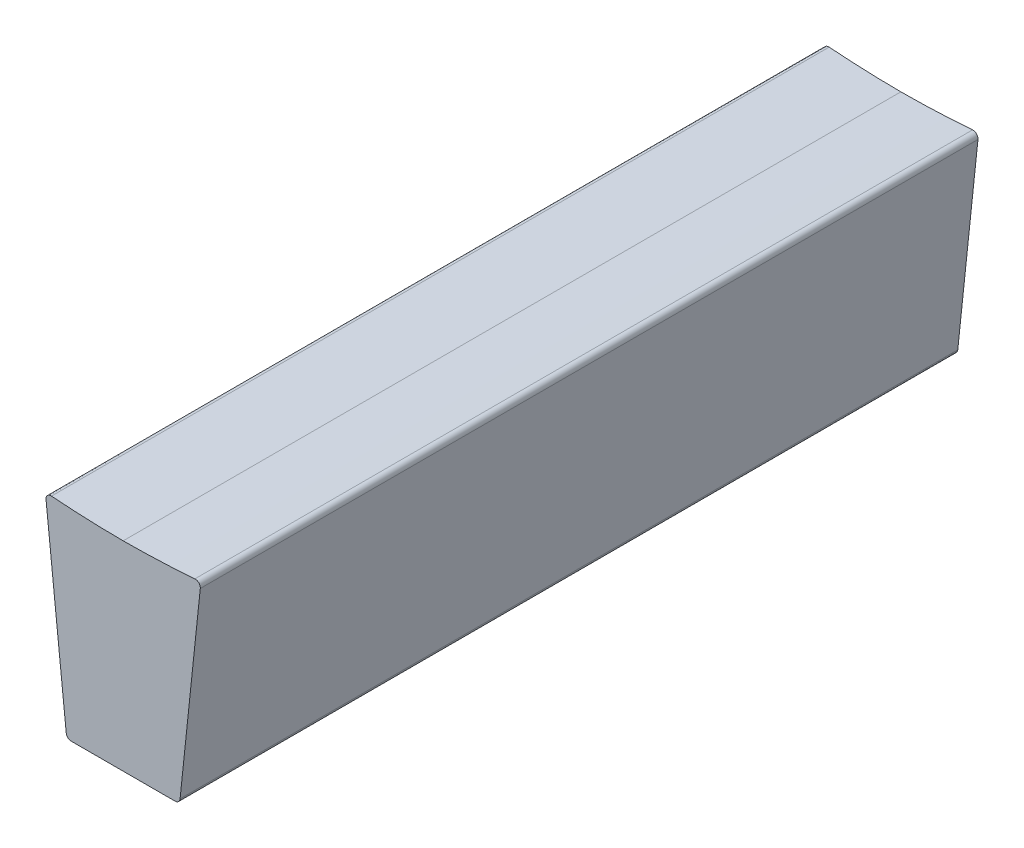
ISO-10303-21;
HEADER;
FILE_DESCRIPTION(('STEP AP214'),'2;1');
FILE_NAME('part.step','',(''),(''),'','','');
FILE_SCHEMA(('AUTOMOTIVE_DESIGN { 1 0 10303 214 1 1 1 1 }'));
ENDSEC;
DATA;
#1=APPLICATION_CONTEXT('core data for automotive mechanical design processes');
#2=APPLICATION_PROTOCOL_DEFINITION('international standard','automotive_design',2000,#1);
#3=PRODUCT_CONTEXT('',#1,'mechanical');
#4=PRODUCT('Part','Part','',(#3));
#5=PRODUCT_RELATED_PRODUCT_CATEGORY('part','',(#4));
#6=PRODUCT_DEFINITION_FORMATION('','',#4);
#7=PRODUCT_DEFINITION_CONTEXT('part definition',#1,'design');
#8=PRODUCT_DEFINITION('design','',#6,#7);
#9=PRODUCT_DEFINITION_SHAPE('','',#8);
#10=(LENGTH_UNIT() NAMED_UNIT(*) SI_UNIT(.MILLI.,.METRE.));
#11=(NAMED_UNIT(*) PLANE_ANGLE_UNIT() SI_UNIT($,.RADIAN.));
#12=(NAMED_UNIT(*) SI_UNIT($,.STERADIAN.) SOLID_ANGLE_UNIT());
#13=UNCERTAINTY_MEASURE_WITH_UNIT(LENGTH_MEASURE(1.E-05),#10,'distance_accuracy_value','');
#14=(GEOMETRIC_REPRESENTATION_CONTEXT(3) GLOBAL_UNCERTAINTY_ASSIGNED_CONTEXT((#13)) GLOBAL_UNIT_ASSIGNED_CONTEXT((#10,
#11,#12)) REPRESENTATION_CONTEXT('',''));
#15=CARTESIAN_POINT('',(0.,0.,0.));
#16=DIRECTION('',(0.,0.,1.));
#17=DIRECTION('',(1.,0.,0.));
#18=AXIS2_PLACEMENT_3D('',#15,#16,#17);
#19=CARTESIAN_POINT('',(-8.3468729420298,0.,-115.));
#20=DIRECTION('',(-0.994521895368274,-0.104528463267651,0.));
#21=DIRECTION('',(0.104528463267651,-0.994521895368274,0.));
#22=AXIS2_PLACEMENT_3D('',#19,#20,#21);
#23=PLANE('',#22);
#24=DIRECTION('',(0.104528463267651,-0.994521895368274,0.));
#25=VECTOR('',#24,1.);
#26=CARTESIAN_POINT('',(-8.3468729420298,0.,-115.));
#27=LINE('',#26,#25);
#28=CARTESIAN_POINT('',(-11.4056023895865,29.1018667309182,-115.));
#29=VERTEX_POINT('',#28);
#30=CARTESIAN_POINT('',(-8.41746133033262,0.671603652549262,-115.));
#31=VERTEX_POINT('',#30);
#32=EDGE_CURVE('E139',#29,#31,#27,.T.);
#33=ORIENTED_EDGE('',*,*,#32,.T.);
#34=DIRECTION('',(0.,0.,1.));
#35=VECTOR('',#34,1.);
#36=CARTESIAN_POINT('',(-8.41746133033262,0.671603652549262,-115.));
#37=LINE('',#36,#35);
#38=CARTESIAN_POINT('',(-8.41746133033262,0.671603652549262,0.));
#39=VERTEX_POINT('',#38);
#40=EDGE_CURVE('E167',#31,#39,#37,.T.);
#41=ORIENTED_EDGE('',*,*,#40,.T.);
#42=DIRECTION('',(0.104528463267651,-0.994521895368274,0.));
#43=VECTOR('',#42,1.);
#44=CARTESIAN_POINT('',(-8.3468729420298,0.,0.));
#45=LINE('',#44,#43);
#46=CARTESIAN_POINT('',(-11.4056023895865,29.1018667309182,0.));
#47=VERTEX_POINT('',#46);
#48=EDGE_CURVE('E128',#47,#39,#45,.T.);
#49=ORIENTED_EDGE('',*,*,#48,.F.);
#50=DIRECTION('',(0.,0.,1.));
#51=VECTOR('',#50,1.);
#52=CARTESIAN_POINT('',(-11.4056023895865,29.1018667309182,-115.));
#53=LINE('',#52,#51);
#54=EDGE_CURVE('E165',#47,#29,#53,.F.);
#55=ORIENTED_EDGE('',*,*,#54,.T.);
#56=EDGE_LOOP('',(#33,#41,#49,#55));
#57=FACE_BOUND('',#56,.T.);
#58=ADVANCED_FACE('F36',(#57),#23,.T.);
#59=CARTESIAN_POINT('',(0.557939675800536,174.832612543413,-115.));
#60=DIRECTION('',(0.,0.,1.));
#61=DIRECTION('',(1.,0.,0.));
#62=AXIS2_PLACEMENT_3D('',#59,#60,#61);
#63=CYLINDRICAL_SURFACE('',#62,145.333683519602);
#64=CARTESIAN_POINT('',(0.557939675800536,174.832612543413,-115.));
#65=DIRECTION('',(0.,0.,-1.));
#66=DIRECTION('',(1.,0.,0.));
#67=AXIS2_PLACEMENT_3D('',#64,#65,#66);
#68=CIRCLE('',#67,145.333683519602);
#69=CARTESIAN_POINT('',(0.,29.5,-115.));
#70=VERTEX_POINT('',#69);
#71=CARTESIAN_POINT('',(-10.6021190605988,29.9280485905279,-115.));
#72=VERTEX_POINT('',#71);
#73=EDGE_CURVE('E113',#70,#72,#68,.T.);
#74=ORIENTED_EDGE('',*,*,#73,.T.);
#75=DIRECTION('',(0.,0.,1.));
#76=VECTOR('',#75,1.);
#77=CARTESIAN_POINT('',(-10.6021190605988,29.9280485905279,-115.));
#78=LINE('',#77,#76);
#79=CARTESIAN_POINT('',(-10.6021190605988,29.9280485905279,0.));
#80=VERTEX_POINT('',#79);
#81=EDGE_CURVE('E11',#72,#80,#78,.T.);
#82=ORIENTED_EDGE('',*,*,#81,.T.);
#83=CARTESIAN_POINT('',(0.557939675800536,174.832612543413,0.));
#84=DIRECTION('',(0.,0.,-1.));
#85=DIRECTION('',(1.,0.,0.));
#86=AXIS2_PLACEMENT_3D('',#83,#84,#85);
#87=CIRCLE('',#86,145.333683519602);
#88=CARTESIAN_POINT('',(0.,29.5,0.));
#89=VERTEX_POINT('',#88);
#90=EDGE_CURVE('E120',#89,#80,#87,.T.);
#91=ORIENTED_EDGE('',*,*,#90,.F.);
#92=DIRECTION('',(0.,0.,1.));
#93=VECTOR('',#92,1.);
#94=CARTESIAN_POINT('',(0.,29.5,-115.));
#95=LINE('',#94,#93);
#96=EDGE_CURVE('E110',#70,#89,#95,.T.);
#97=ORIENTED_EDGE('',*,*,#96,.F.);
#98=EDGE_LOOP('',(#74,#82,#91,#97));
#99=FACE_BOUND('',#98,.T.);
#100=ADVANCED_FACE('F117',(#99),#63,.F.);
#101=CARTESIAN_POINT('',(-0.557939675800536,174.832612543413,-115.));
#102=DIRECTION('',(0.,0.,1.));
#103=DIRECTION('',(1.,0.,0.));
#104=AXIS2_PLACEMENT_3D('',#101,#102,#103);
#105=CYLINDRICAL_SURFACE('',#104,145.333683519602);
#106=CARTESIAN_POINT('',(-0.557939675800536,174.832612543413,0.));
#107=DIRECTION('',(0.,0.,-1.));
#108=DIRECTION('',(-1.,0.,0.));
#109=AXIS2_PLACEMENT_3D('',#106,#107,#108);
#110=CIRCLE('',#109,145.333683519602);
#111=CARTESIAN_POINT('',(10.6021190605988,29.9280485905279,0.));
#112=VERTEX_POINT('',#111);
#113=EDGE_CURVE('E137',#112,#89,#110,.T.);
#114=ORIENTED_EDGE('',*,*,#113,.F.);
#115=DIRECTION('',(0.,0.,1.));
#116=VECTOR('',#115,1.);
#117=CARTESIAN_POINT('',(10.6021190605988,29.9280485905279,-115.));
#118=LINE('',#117,#116);
#119=CARTESIAN_POINT('',(10.6021190605988,29.9280485905279,-115.));
#120=VERTEX_POINT('',#119);
#121=EDGE_CURVE('E44',#112,#120,#118,.F.);
#122=ORIENTED_EDGE('',*,*,#121,.T.);
#123=CARTESIAN_POINT('',(-0.557939675800536,174.832612543413,-115.));
#124=DIRECTION('',(0.,0.,-1.));
#125=DIRECTION('',(-1.,0.,0.));
#126=AXIS2_PLACEMENT_3D('',#123,#124,#125);
#127=CIRCLE('',#126,145.333683519602);
#128=EDGE_CURVE('E107',#120,#70,#127,.T.);
#129=ORIENTED_EDGE('',*,*,#128,.T.);
#130=ORIENTED_EDGE('',*,*,#96,.T.);
#131=EDGE_LOOP('',(#114,#122,#129,#130));
#132=FACE_BOUND('',#131,.T.);
#133=ADVANCED_FACE('F109',(#132),#105,.F.);
#134=CARTESIAN_POINT('',(8.3468729420298,0.,-115.));
#135=DIRECTION('',(0.994521895368274,-0.104528463267651,0.));
#136=DIRECTION('',(0.104528463267651,0.994521895368274,0.));
#137=AXIS2_PLACEMENT_3D('',#134,#135,#136);
#138=PLANE('',#137);
#139=DIRECTION('',(0.104528463267651,0.994521895368274,0.));
#140=VECTOR('',#139,1.);
#141=CARTESIAN_POINT('',(8.3468729420298,0.,0.));
#142=LINE('',#141,#140);
#143=CARTESIAN_POINT('',(8.41746133033262,0.671603652549262,0.));
#144=VERTEX_POINT('',#143);
#145=CARTESIAN_POINT('',(11.4056023895865,29.1018667309182,0.));
#146=VERTEX_POINT('',#145);
#147=EDGE_CURVE('E134',#144,#146,#142,.T.);
#148=ORIENTED_EDGE('',*,*,#147,.F.);
#149=DIRECTION('',(0.,0.,1.));
#150=VECTOR('',#149,1.);
#151=CARTESIAN_POINT('',(8.41746133033262,0.671603652549262,-115.));
#152=LINE('',#151,#150);
#153=CARTESIAN_POINT('',(8.41746133033262,0.671603652549262,-115.));
#154=VERTEX_POINT('',#153);
#155=EDGE_CURVE('E156',#144,#154,#152,.F.);
#156=ORIENTED_EDGE('',*,*,#155,.T.);
#157=DIRECTION('',(0.104528463267651,0.994521895368274,0.));
#158=VECTOR('',#157,1.);
#159=CARTESIAN_POINT('',(8.3468729420298,0.,-115.));
#160=LINE('',#159,#158);
#161=CARTESIAN_POINT('',(11.4056023895865,29.1018667309182,-115.));
#162=VERTEX_POINT('',#161);
#163=EDGE_CURVE('E114',#154,#162,#160,.T.);
#164=ORIENTED_EDGE('',*,*,#163,.T.);
#165=DIRECTION('',(0.,0.,1.));
#166=VECTOR('',#165,1.);
#167=CARTESIAN_POINT('',(11.4056023895865,29.1018667309182,-115.));
#168=LINE('',#167,#166);
#169=EDGE_CURVE('E153',#162,#146,#168,.T.);
#170=ORIENTED_EDGE('',*,*,#169,.T.);
#171=EDGE_LOOP('',(#148,#156,#164,#170));
#172=FACE_BOUND('',#171,.T.);
#173=ADVANCED_FACE('F189',(#172),#138,.T.);
#174=CARTESIAN_POINT('',(8.3468729420298,0.,-115.));
#175=DIRECTION('',(0.,-1.,0.));
#176=DIRECTION('',(0.,0.,-1.));
#177=AXIS2_PLACEMENT_3D('',#174,#175,#176);
#178=PLANE('',#177);
#179=DIRECTION('',(1.,0.,0.));
#180=VECTOR('',#179,1.);
#181=CARTESIAN_POINT('',(8.3468729420298,0.,-115.));
#182=LINE('',#181,#180);
#183=CARTESIAN_POINT('',(-7.67156990880641,0.,-115.));
#184=VERTEX_POINT('',#183);
#185=CARTESIAN_POINT('',(7.67156990880641,0.,-115.));
#186=VERTEX_POINT('',#185);
#187=EDGE_CURVE('E181',#184,#186,#182,.T.);
#188=ORIENTED_EDGE('',*,*,#187,.T.);
#189=DIRECTION('',(0.,0.,1.));
#190=VECTOR('',#189,1.);
#191=CARTESIAN_POINT('',(7.67156990880641,0.,-115.));
#192=LINE('',#191,#190);
#193=CARTESIAN_POINT('',(7.67156990880641,0.,0.));
#194=VERTEX_POINT('',#193);
#195=EDGE_CURVE('E142',#186,#194,#192,.T.);
#196=ORIENTED_EDGE('',*,*,#195,.T.);
#197=DIRECTION('',(1.,0.,0.));
#198=VECTOR('',#197,1.);
#199=CARTESIAN_POINT('',(8.3468729420298,0.,0.));
#200=LINE('',#199,#198);
#201=CARTESIAN_POINT('',(-7.67156990880641,0.,0.));
#202=VERTEX_POINT('',#201);
#203=EDGE_CURVE('E131',#202,#194,#200,.T.);
#204=ORIENTED_EDGE('',*,*,#203,.F.);
#205=DIRECTION('',(0.,0.,1.));
#206=VECTOR('',#205,1.);
#207=CARTESIAN_POINT('',(-7.67156990880641,0.,-115.));
#208=LINE('',#207,#206);
#209=EDGE_CURVE('E121',#202,#184,#208,.F.);
#210=ORIENTED_EDGE('',*,*,#209,.T.);
#211=EDGE_LOOP('',(#188,#196,#204,#210));
#212=FACE_BOUND('',#211,.T.);
#213=ADVANCED_FACE('F198',(#212),#178,.T.);
#214=CARTESIAN_POINT('',(0.557939675800536,174.832612543413,-115.));
#215=DIRECTION('',(0.,0.,1.));
#216=DIRECTION('',(1.,0.,0.));
#217=AXIS2_PLACEMENT_3D('',#214,#215,#216);
#218=PLANE('',#217);
#219=ORIENTED_EDGE('',*,*,#163,.F.);
#220=CARTESIAN_POINT('',(7.67156990880641,0.75,-115.));
#221=DIRECTION('',(0.,0.,1.));
#222=DIRECTION('',(1.,0.,0.));
#223=AXIS2_PLACEMENT_3D('',#220,#221,#222);
#224=CIRCLE('',#223,0.75);
#225=EDGE_CURVE('E163',#154,#186,#224,.F.);
#226=ORIENTED_EDGE('',*,*,#225,.T.);
#227=ORIENTED_EDGE('',*,*,#187,.F.);
#228=CARTESIAN_POINT('',(-7.67156990880641,0.75,-115.));
#229=DIRECTION('',(0.,0.,1.));
#230=DIRECTION('',(1.,0.,0.));
#231=AXIS2_PLACEMENT_3D('',#228,#229,#230);
#232=CIRCLE('',#231,0.75);
#233=EDGE_CURVE('E161',#184,#31,#232,.F.);
#234=ORIENTED_EDGE('',*,*,#233,.T.);
#235=ORIENTED_EDGE('',*,*,#32,.F.);
#236=CARTESIAN_POINT('',(-10.6597109680603,29.1802630783689,-115.));
#237=DIRECTION('',(0.,0.,1.));
#238=DIRECTION('',(1.,0.,0.));
#239=AXIS2_PLACEMENT_3D('',#236,#237,#238);
#240=CIRCLE('',#239,0.75);
#241=EDGE_CURVE('E58',#29,#72,#240,.F.);
#242=ORIENTED_EDGE('',*,*,#241,.T.);
#243=ORIENTED_EDGE('',*,*,#73,.F.);
#244=ORIENTED_EDGE('',*,*,#128,.F.);
#245=CARTESIAN_POINT('',(10.6597109680603,29.1802630783689,-115.));
#246=DIRECTION('',(0.,0.,1.));
#247=DIRECTION('',(1.,0.,0.));
#248=AXIS2_PLACEMENT_3D('',#245,#246,#247);
#249=CIRCLE('',#248,0.75);
#250=EDGE_CURVE('E159',#120,#162,#249,.F.);
#251=ORIENTED_EDGE('',*,*,#250,.T.);
#252=EDGE_LOOP('',(#219,#226,#227,#234,#235,#242,#243,#244,#251));
#253=FACE_BOUND('',#252,.T.);
#254=ADVANCED_FACE('F124',(#253),#218,.F.);
#255=CARTESIAN_POINT('',(0.557939675800536,174.832612543413,0.));
#256=DIRECTION('',(0.,0.,1.));
#257=DIRECTION('',(1.,0.,0.));
#258=AXIS2_PLACEMENT_3D('',#255,#256,#257);
#259=PLANE('',#258);
#260=ORIENTED_EDGE('',*,*,#203,.T.);
#261=CARTESIAN_POINT('',(7.67156990880641,0.75,0.));
#262=DIRECTION('',(0.,0.,1.));
#263=DIRECTION('',(1.,0.,0.));
#264=AXIS2_PLACEMENT_3D('',#261,#262,#263);
#265=CIRCLE('',#264,0.75);
#266=EDGE_CURVE('E151',#194,#144,#265,.T.);
#267=ORIENTED_EDGE('',*,*,#266,.T.);
#268=ORIENTED_EDGE('',*,*,#147,.T.);
#269=CARTESIAN_POINT('',(10.6597109680603,29.1802630783689,0.));
#270=DIRECTION('',(0.,0.,1.));
#271=DIRECTION('',(1.,0.,0.));
#272=AXIS2_PLACEMENT_3D('',#269,#270,#271);
#273=CIRCLE('',#272,0.75);
#274=EDGE_CURVE('E147',#146,#112,#273,.T.);
#275=ORIENTED_EDGE('',*,*,#274,.T.);
#276=ORIENTED_EDGE('',*,*,#113,.T.);
#277=ORIENTED_EDGE('',*,*,#90,.T.);
#278=CARTESIAN_POINT('',(-10.6597109680603,29.1802630783689,0.));
#279=DIRECTION('',(0.,0.,1.));
#280=DIRECTION('',(1.,0.,0.));
#281=AXIS2_PLACEMENT_3D('',#278,#279,#280);
#282=CIRCLE('',#281,0.75);
#283=EDGE_CURVE('E145',#80,#47,#282,.T.);
#284=ORIENTED_EDGE('',*,*,#283,.T.);
#285=ORIENTED_EDGE('',*,*,#48,.T.);
#286=CARTESIAN_POINT('',(-7.67156990880641,0.75,0.));
#287=DIRECTION('',(0.,0.,1.));
#288=DIRECTION('',(1.,0.,0.));
#289=AXIS2_PLACEMENT_3D('',#286,#287,#288);
#290=CIRCLE('',#289,0.75);
#291=EDGE_CURVE('E149',#39,#202,#290,.T.);
#292=ORIENTED_EDGE('',*,*,#291,.T.);
#293=EDGE_LOOP('',(#260,#267,#268,#275,#276,#277,#284,#285,#292));
#294=FACE_BOUND('',#293,.T.);
#295=ADVANCED_FACE('F177',(#294),#259,.T.);
#296=CARTESIAN_POINT('',(7.67156990880641,0.75,-115.));
#297=DIRECTION('',(0.,0.,1.));
#298=DIRECTION('',(1.,0.,0.));
#299=AXIS2_PLACEMENT_3D('',#296,#297,#298);
#300=CYLINDRICAL_SURFACE('',#299,0.75);
#301=ORIENTED_EDGE('',*,*,#225,.F.);
#302=ORIENTED_EDGE('',*,*,#155,.F.);
#303=ORIENTED_EDGE('',*,*,#266,.F.);
#304=ORIENTED_EDGE('',*,*,#195,.F.);
#305=EDGE_LOOP('',(#301,#302,#303,#304));
#306=FACE_BOUND('',#305,.T.);
#307=ADVANCED_FACE('F195',(#306),#300,.T.);
#308=CARTESIAN_POINT('',(-7.67156990880641,0.75,-115.));
#309=DIRECTION('',(0.,0.,1.));
#310=DIRECTION('',(1.,0.,0.));
#311=AXIS2_PLACEMENT_3D('',#308,#309,#310);
#312=CYLINDRICAL_SURFACE('',#311,0.75);
#313=ORIENTED_EDGE('',*,*,#233,.F.);
#314=ORIENTED_EDGE('',*,*,#209,.F.);
#315=ORIENTED_EDGE('',*,*,#291,.F.);
#316=ORIENTED_EDGE('',*,*,#40,.F.);
#317=EDGE_LOOP('',(#313,#314,#315,#316));
#318=FACE_BOUND('',#317,.T.);
#319=ADVANCED_FACE('F200',(#318),#312,.T.);
#320=CARTESIAN_POINT('',(10.6597109680603,29.1802630783689,-115.));
#321=DIRECTION('',(0.,0.,1.));
#322=DIRECTION('',(1.,0.,0.));
#323=AXIS2_PLACEMENT_3D('',#320,#321,#322);
#324=CYLINDRICAL_SURFACE('',#323,0.75);
#325=ORIENTED_EDGE('',*,*,#250,.F.);
#326=ORIENTED_EDGE('',*,*,#121,.F.);
#327=ORIENTED_EDGE('',*,*,#274,.F.);
#328=ORIENTED_EDGE('',*,*,#169,.F.);
#329=EDGE_LOOP('',(#325,#326,#327,#328));
#330=FACE_BOUND('',#329,.T.);
#331=ADVANCED_FACE('F193',(#330),#324,.T.);
#332=CARTESIAN_POINT('',(-10.6597109680603,29.1802630783689,-115.));
#333=DIRECTION('',(0.,0.,1.));
#334=DIRECTION('',(1.,0.,0.));
#335=AXIS2_PLACEMENT_3D('',#332,#333,#334);
#336=CYLINDRICAL_SURFACE('',#335,0.75);
#337=ORIENTED_EDGE('',*,*,#241,.F.);
#338=ORIENTED_EDGE('',*,*,#54,.F.);
#339=ORIENTED_EDGE('',*,*,#283,.F.);
#340=ORIENTED_EDGE('',*,*,#81,.F.);
#341=EDGE_LOOP('',(#337,#338,#339,#340));
#342=FACE_BOUND('',#341,.T.);
#343=ADVANCED_FACE('F38',(#342),#336,.T.);
#344=CLOSED_SHELL('',(#58,#100,#133,#173,#213,#254,#295,#307,#319,#331,#343));
#345=MANIFOLD_SOLID_BREP('B2',#344);
#346=ADVANCED_BREP_SHAPE_REPRESENTATION('',(#18,#345),#14);
#347=SHAPE_DEFINITION_REPRESENTATION(#9,#346);
ENDSEC;
END-ISO-10303-21;
